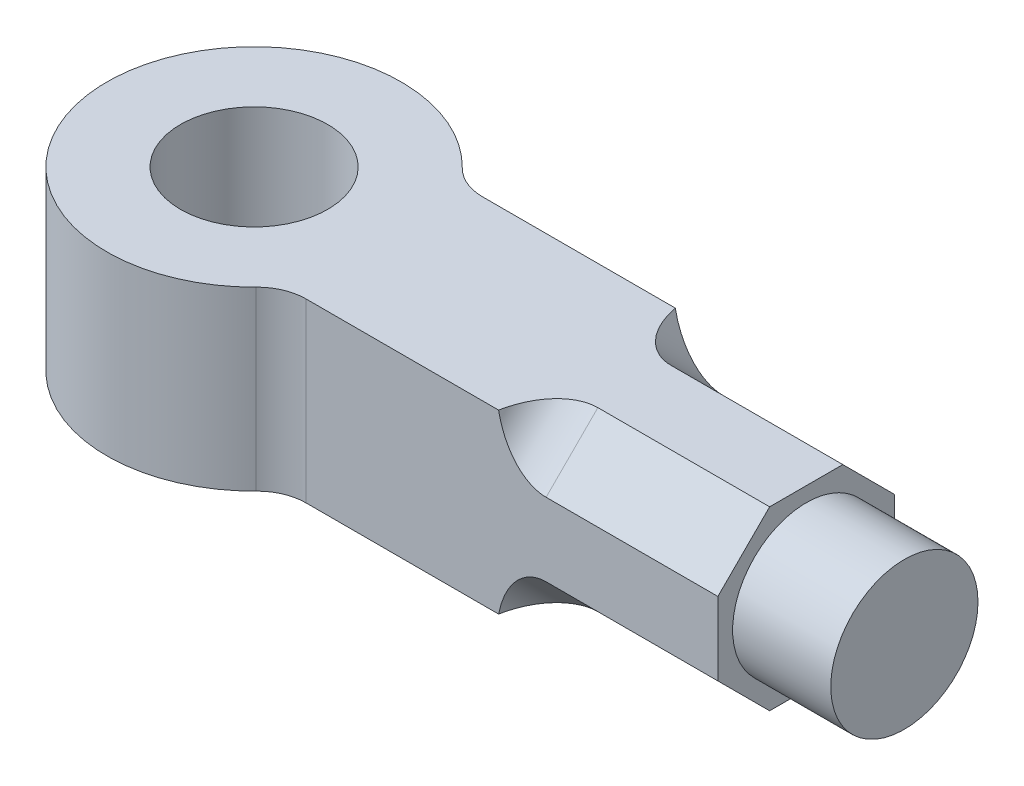
ISO-10303-21;
HEADER;
FILE_DESCRIPTION(('STEP AP214'),'2;1');
FILE_NAME('part.step','',(''),(''),'','','');
FILE_SCHEMA(('AUTOMOTIVE_DESIGN { 1 0 10303 214 1 1 1 1 }'));
ENDSEC;
DATA;
#1=APPLICATION_CONTEXT('core data for automotive mechanical design processes');
#2=APPLICATION_PROTOCOL_DEFINITION('international standard','automotive_design',2000,#1);
#3=PRODUCT_CONTEXT('',#1,'mechanical');
#4=PRODUCT('Part','Part','',(#3));
#5=PRODUCT_RELATED_PRODUCT_CATEGORY('part','',(#4));
#6=PRODUCT_DEFINITION_FORMATION('','',#4);
#7=PRODUCT_DEFINITION_CONTEXT('part definition',#1,'design');
#8=PRODUCT_DEFINITION('design','',#6,#7);
#9=PRODUCT_DEFINITION_SHAPE('','',#8);
#10=(LENGTH_UNIT() NAMED_UNIT(*) SI_UNIT(.MILLI.,.METRE.));
#11=(NAMED_UNIT(*) PLANE_ANGLE_UNIT() SI_UNIT($,.RADIAN.));
#12=(NAMED_UNIT(*) SI_UNIT($,.STERADIAN.) SOLID_ANGLE_UNIT());
#13=UNCERTAINTY_MEASURE_WITH_UNIT(LENGTH_MEASURE(1.E-05),#10,'distance_accuracy_value','');
#14=(GEOMETRIC_REPRESENTATION_CONTEXT(3) GLOBAL_UNCERTAINTY_ASSIGNED_CONTEXT((#13)) GLOBAL_UNIT_ASSIGNED_CONTEXT((#10,
#11,#12)) REPRESENTATION_CONTEXT('',''));
#15=CARTESIAN_POINT('',(0.,0.,0.));
#16=DIRECTION('',(0.,0.,1.));
#17=DIRECTION('',(1.,0.,0.));
#18=AXIS2_PLACEMENT_3D('',#15,#16,#17);
#19=CARTESIAN_POINT('',(0.,18.,0.));
#20=DIRECTION('',(0.,1.,0.));
#21=DIRECTION('',(0.,0.,1.));
#22=AXIS2_PLACEMENT_3D('',#19,#20,#21);
#23=PLANE('',#22);
#24=CARTESIAN_POINT('',(0.,18.,0.));
#25=DIRECTION('',(0.,1.,0.));
#26=DIRECTION('',(0.,0.,1.));
#27=AXIS2_PLACEMENT_3D('',#24,#25,#26);
#28=CIRCLE('',#27,30.);
#29=CARTESIAN_POINT('',(21.4242852856286,18.,-21.));
#30=VERTEX_POINT('',#29);
#31=CARTESIAN_POINT('',(21.4242852856285,18.,21.));
#32=VERTEX_POINT('',#31);
#33=EDGE_CURVE('E180',#30,#32,#28,.T.);
#34=ORIENTED_EDGE('',*,*,#33,.T.);
#35=CARTESIAN_POINT('',(28.5657137141714,18.,28.));
#36=DIRECTION('',(0.,1.,0.));
#37=DIRECTION('',(0.,0.,1.));
#38=AXIS2_PLACEMENT_3D('',#35,#36,#37);
#39=CIRCLE('',#38,10.);
#40=CARTESIAN_POINT('',(28.5657137141714,18.,18.));
#41=VERTEX_POINT('',#40);
#42=EDGE_CURVE('E11',#32,#41,#39,.F.);
#43=ORIENTED_EDGE('',*,*,#42,.T.);
#44=DIRECTION('',(1.,0.,0.));
#45=VECTOR('',#44,1.);
#46=CARTESIAN_POINT('',(24.,18.,18.));
#47=LINE('',#46,#45);
#48=CARTESIAN_POINT('',(67.8290501566764,18.,18.));
#49=VERTEX_POINT('',#48);
#50=EDGE_CURVE('E183',#41,#49,#47,.T.);
#51=ORIENTED_EDGE('',*,*,#50,.T.);
#52=CARTESIAN_POINT('',(77.5,18.,21.5979797464467));
#53=DIRECTION('',(0.,1.,0.));
#54=DIRECTION('',(0.,0.,-1.));
#55=AXIS2_PLACEMENT_3D('',#52,#53,#54);
#56=ELLIPSE('',#55,14.1421356237309,10.);
#57=CARTESIAN_POINT('',(77.5,18.,7.45584412271571));
#58=VERTEX_POINT('',#57);
#59=EDGE_CURVE('E219',#49,#58,#56,.F.);
#60=ORIENTED_EDGE('',*,*,#59,.T.);
#61=DIRECTION('',(-1.,0.,0.));
#62=VECTOR('',#61,1.);
#63=CARTESIAN_POINT('',(112.5,18.,7.45584412271571));
#64=LINE('',#63,#62);
#65=CARTESIAN_POINT('',(112.5,18.,7.45584412271571));
#66=VERTEX_POINT('',#65);
#67=EDGE_CURVE('E245',#66,#58,#64,.T.);
#68=ORIENTED_EDGE('',*,*,#67,.F.);
#69=DIRECTION('',(0.,0.,1.));
#70=VECTOR('',#69,1.);
#71=CARTESIAN_POINT('',(112.5,18.,-7.45584412271571));
#72=LINE('',#71,#70);
#73=CARTESIAN_POINT('',(112.5,18.,-7.45584412271571));
#74=VERTEX_POINT('',#73);
#75=EDGE_CURVE('E155',#74,#66,#72,.T.);
#76=ORIENTED_EDGE('',*,*,#75,.F.);
#77=DIRECTION('',(-1.,0.,0.));
#78=VECTOR('',#77,1.);
#79=CARTESIAN_POINT('',(112.5,18.,-7.45584412271571));
#80=LINE('',#79,#78);
#81=CARTESIAN_POINT('',(77.5,18.,-7.45584412271571));
#82=VERTEX_POINT('',#81);
#83=EDGE_CURVE('E247',#74,#82,#80,.T.);
#84=ORIENTED_EDGE('',*,*,#83,.T.);
#85=CARTESIAN_POINT('',(77.5,18.,-21.5979797464467));
#86=DIRECTION('',(0.,1.,0.));
#87=DIRECTION('',(0.,0.,-1.));
#88=AXIS2_PLACEMENT_3D('',#85,#86,#87);
#89=ELLIPSE('',#88,14.1421356237309,10.);
#90=CARTESIAN_POINT('',(67.8290501566764,18.,-18.));
#91=VERTEX_POINT('',#90);
#92=EDGE_CURVE('E212',#82,#91,#89,.F.);
#93=ORIENTED_EDGE('',*,*,#92,.T.);
#94=DIRECTION('',(-1.,0.,0.));
#95=VECTOR('',#94,1.);
#96=CARTESIAN_POINT('',(24.,18.,-18.));
#97=LINE('',#96,#95);
#98=CARTESIAN_POINT('',(28.5657137141714,18.,-18.));
#99=VERTEX_POINT('',#98);
#100=EDGE_CURVE('E177',#91,#99,#97,.T.);
#101=ORIENTED_EDGE('',*,*,#100,.T.);
#102=CARTESIAN_POINT('',(28.5657137141714,18.,-28.));
#103=DIRECTION('',(0.,1.,0.));
#104=DIRECTION('',(0.,0.,1.));
#105=AXIS2_PLACEMENT_3D('',#102,#103,#104);
#106=CIRCLE('',#105,10.);
#107=EDGE_CURVE('E232',#99,#30,#106,.F.);
#108=ORIENTED_EDGE('',*,*,#107,.T.);
#109=EDGE_LOOP('',(#34,#43,#51,#60,#68,#76,#84,#93,#101,#108));
#110=FACE_BOUND('',#109,.T.);
#111=CARTESIAN_POINT('',(0.,18.,0.));
#112=DIRECTION('',(0.,1.,0.));
#113=DIRECTION('',(0.,0.,1.));
#114=AXIS2_PLACEMENT_3D('',#111,#112,#113);
#115=CIRCLE('',#114,15.);
#116=CARTESIAN_POINT('',(0.,18.,15.));
#117=VERTEX_POINT('',#116);
#118=EDGE_CURVE('E168',#117,#117,#115,.T.);
#119=ORIENTED_EDGE('',*,*,#118,.F.);
#120=EDGE_LOOP('',(#119));
#121=FACE_BOUND('',#120,.T.);
#122=ADVANCED_FACE('F39',(#110,#121),#23,.T.);
#123=CARTESIAN_POINT('',(0.,-18.,0.));
#124=DIRECTION('',(0.,1.,0.));
#125=DIRECTION('',(0.,0.,1.));
#126=AXIS2_PLACEMENT_3D('',#123,#124,#125);
#127=PLANE('',#126);
#128=DIRECTION('',(-1.,0.,0.));
#129=VECTOR('',#128,1.);
#130=CARTESIAN_POINT('',(112.5,-18.,7.4558441227157));
#131=LINE('',#130,#129);
#132=CARTESIAN_POINT('',(112.5,-18.,7.4558441227157));
#133=VERTEX_POINT('',#132);
#134=CARTESIAN_POINT('',(77.5,-18.,7.4558441227157));
#135=VERTEX_POINT('',#134);
#136=EDGE_CURVE('E170',#133,#135,#131,.T.);
#137=ORIENTED_EDGE('',*,*,#136,.T.);
#138=CARTESIAN_POINT('',(77.5,-18.,21.5979797464467));
#139=DIRECTION('',(0.,1.,0.));
#140=DIRECTION('',(0.,0.,1.));
#141=AXIS2_PLACEMENT_3D('',#138,#139,#140);
#142=ELLIPSE('',#141,14.142135623731,10.);
#143=CARTESIAN_POINT('',(67.8290501566764,-18.,18.));
#144=VERTEX_POINT('',#143);
#145=EDGE_CURVE('E202',#135,#144,#142,.T.);
#146=ORIENTED_EDGE('',*,*,#145,.T.);
#147=DIRECTION('',(1.,0.,0.));
#148=VECTOR('',#147,1.);
#149=CARTESIAN_POINT('',(24.,-18.,18.));
#150=LINE('',#149,#148);
#151=CARTESIAN_POINT('',(28.5657137141714,-18.,18.));
#152=VERTEX_POINT('',#151);
#153=EDGE_CURVE('E181',#152,#144,#150,.T.);
#154=ORIENTED_EDGE('',*,*,#153,.F.);
#155=CARTESIAN_POINT('',(28.5657137141714,-18.,28.));
#156=DIRECTION('',(0.,1.,0.));
#157=DIRECTION('',(0.,0.,1.));
#158=AXIS2_PLACEMENT_3D('',#155,#156,#157);
#159=CIRCLE('',#158,10.);
#160=CARTESIAN_POINT('',(21.4242852856285,-18.,21.));
#161=VERTEX_POINT('',#160);
#162=EDGE_CURVE('E47',#152,#161,#159,.T.);
#163=ORIENTED_EDGE('',*,*,#162,.T.);
#164=CARTESIAN_POINT('',(0.,-18.,0.));
#165=DIRECTION('',(0.,1.,0.));
#166=DIRECTION('',(0.,0.,1.));
#167=AXIS2_PLACEMENT_3D('',#164,#165,#166);
#168=CIRCLE('',#167,30.);
#169=CARTESIAN_POINT('',(21.4242852856286,-18.,-21.));
#170=VERTEX_POINT('',#169);
#171=EDGE_CURVE('E188',#170,#161,#168,.T.);
#172=ORIENTED_EDGE('',*,*,#171,.F.);
#173=CARTESIAN_POINT('',(28.5657137141714,-18.,-28.));
#174=DIRECTION('',(0.,1.,0.));
#175=DIRECTION('',(0.,0.,1.));
#176=AXIS2_PLACEMENT_3D('',#173,#174,#175);
#177=CIRCLE('',#176,10.);
#178=CARTESIAN_POINT('',(28.5657137141714,-18.,-18.));
#179=VERTEX_POINT('',#178);
#180=EDGE_CURVE('E230',#170,#179,#177,.T.);
#181=ORIENTED_EDGE('',*,*,#180,.T.);
#182=DIRECTION('',(-1.,0.,0.));
#183=VECTOR('',#182,1.);
#184=CARTESIAN_POINT('',(24.,-18.,-18.));
#185=LINE('',#184,#183);
#186=CARTESIAN_POINT('',(67.8290501566764,-18.,-18.));
#187=VERTEX_POINT('',#186);
#188=EDGE_CURVE('E175',#187,#179,#185,.T.);
#189=ORIENTED_EDGE('',*,*,#188,.F.);
#190=CARTESIAN_POINT('',(77.5,-18.,-21.5979797464467));
#191=DIRECTION('',(0.,1.,0.));
#192=DIRECTION('',(0.,0.,1.));
#193=AXIS2_PLACEMENT_3D('',#190,#191,#192);
#194=ELLIPSE('',#193,14.142135623731,10.);
#195=CARTESIAN_POINT('',(77.5,-18.,-7.45584412271571));
#196=VERTEX_POINT('',#195);
#197=EDGE_CURVE('E210',#187,#196,#194,.T.);
#198=ORIENTED_EDGE('',*,*,#197,.T.);
#199=DIRECTION('',(-1.,0.,0.));
#200=VECTOR('',#199,1.);
#201=CARTESIAN_POINT('',(112.5,-18.,-7.45584412271571));
#202=LINE('',#201,#200);
#203=CARTESIAN_POINT('',(112.5,-18.,-7.45584412271571));
#204=VERTEX_POINT('',#203);
#205=EDGE_CURVE('E300',#204,#196,#202,.T.);
#206=ORIENTED_EDGE('',*,*,#205,.F.);
#207=DIRECTION('',(0.,0.,-1.));
#208=VECTOR('',#207,1.);
#209=CARTESIAN_POINT('',(112.5,-18.,7.4558441227157));
#210=LINE('',#209,#208);
#211=EDGE_CURVE('E312',#133,#204,#210,.T.);
#212=ORIENTED_EDGE('',*,*,#211,.F.);
#213=EDGE_LOOP('',(#137,#146,#154,#163,#172,#181,#189,#198,#206,#212));
#214=FACE_BOUND('',#213,.T.);
#215=CARTESIAN_POINT('',(0.,-18.,0.));
#216=DIRECTION('',(0.,1.,0.));
#217=DIRECTION('',(0.,0.,1.));
#218=AXIS2_PLACEMENT_3D('',#215,#216,#217);
#219=CIRCLE('',#218,15.);
#220=CARTESIAN_POINT('',(0.,-18.,15.));
#221=VERTEX_POINT('',#220);
#222=EDGE_CURVE('E165',#221,#221,#219,.T.);
#223=ORIENTED_EDGE('',*,*,#222,.T.);
#224=EDGE_LOOP('',(#223));
#225=FACE_BOUND('',#224,.T.);
#226=ADVANCED_FACE('F237',(#214,#225),#127,.F.);
#227=CARTESIAN_POINT('',(24.,18.,-18.));
#228=DIRECTION('',(0.,0.,1.));
#229=DIRECTION('',(1.,0.,0.));
#230=AXIS2_PLACEMENT_3D('',#227,#228,#229);
#231=PLANE('',#230);
#232=ORIENTED_EDGE('',*,*,#188,.T.);
#233=DIRECTION('',(0.,1.,0.));
#234=VECTOR('',#233,1.);
#235=CARTESIAN_POINT('',(28.5657137141714,18.,-18.));
#236=LINE('',#235,#234);
#237=EDGE_CURVE('E226',#179,#99,#236,.T.);
#238=ORIENTED_EDGE('',*,*,#237,.T.);
#239=ORIENTED_EDGE('',*,*,#100,.F.);
#240=CARTESIAN_POINT('',(77.5,21.5979797464467,-18.));
#241=DIRECTION('',(0.,0.,1.));
#242=DIRECTION('',(0.,-1.,0.));
#243=AXIS2_PLACEMENT_3D('',#240,#241,#242);
#244=ELLIPSE('',#243,14.142135623731,10.);
#245=CARTESIAN_POINT('',(77.5,7.45584412271571,-18.));
#246=VERTEX_POINT('',#245);
#247=EDGE_CURVE('E215',#91,#246,#244,.T.);
#248=ORIENTED_EDGE('',*,*,#247,.T.);
#249=DIRECTION('',(-1.,0.,0.));
#250=VECTOR('',#249,1.);
#251=CARTESIAN_POINT('',(112.5,7.45584412271571,-18.));
#252=LINE('',#251,#250);
#253=CARTESIAN_POINT('',(112.5,7.45584412271571,-18.));
#254=VERTEX_POINT('',#253);
#255=EDGE_CURVE('E303',#254,#246,#252,.T.);
#256=ORIENTED_EDGE('',*,*,#255,.F.);
#257=DIRECTION('',(0.,1.,0.));
#258=VECTOR('',#257,1.);
#259=CARTESIAN_POINT('',(112.5,-7.45584412271571,-18.));
#260=LINE('',#259,#258);
#261=CARTESIAN_POINT('',(112.5,-7.45584412271571,-18.));
#262=VERTEX_POINT('',#261);
#263=EDGE_CURVE('E302',#262,#254,#260,.T.);
#264=ORIENTED_EDGE('',*,*,#263,.F.);
#265=DIRECTION('',(-1.,0.,0.));
#266=VECTOR('',#265,1.);
#267=CARTESIAN_POINT('',(112.5,-7.45584412271571,-18.));
#268=LINE('',#267,#266);
#269=CARTESIAN_POINT('',(77.5,-7.45584412271571,-18.));
#270=VERTEX_POINT('',#269);
#271=EDGE_CURVE('E297',#262,#270,#268,.T.);
#272=ORIENTED_EDGE('',*,*,#271,.T.);
#273=CARTESIAN_POINT('',(77.5,-21.5979797464467,-18.));
#274=DIRECTION('',(0.,0.,1.));
#275=DIRECTION('',(0.,-1.,0.));
#276=AXIS2_PLACEMENT_3D('',#273,#274,#275);
#277=ELLIPSE('',#276,14.1421356237309,10.);
#278=EDGE_CURVE('E207',#270,#187,#277,.T.);
#279=ORIENTED_EDGE('',*,*,#278,.T.);
#280=EDGE_LOOP('',(#232,#238,#239,#248,#256,#264,#272,#279));
#281=FACE_BOUND('',#280,.T.);
#282=ADVANCED_FACE('F267',(#281),#231,.F.);
#283=CARTESIAN_POINT('',(0.,18.,0.));
#284=DIRECTION('',(0.,-1.,0.));
#285=DIRECTION('',(0.,0.,-1.));
#286=AXIS2_PLACEMENT_3D('',#283,#284,#285);
#287=CYLINDRICAL_SURFACE('',#286,30.);
#288=ORIENTED_EDGE('',*,*,#33,.F.);
#289=DIRECTION('',(0.,-1.,0.));
#290=VECTOR('',#289,1.);
#291=CARTESIAN_POINT('',(21.4242852856286,18.,-21.));
#292=LINE('',#291,#290);
#293=EDGE_CURVE('E223',#30,#170,#292,.T.);
#294=ORIENTED_EDGE('',*,*,#293,.T.);
#295=ORIENTED_EDGE('',*,*,#171,.T.);
#296=DIRECTION('',(0.,-1.,0.));
#297=VECTOR('',#296,1.);
#298=CARTESIAN_POINT('',(21.4242852856285,18.,21.));
#299=LINE('',#298,#297);
#300=EDGE_CURVE('E221',#161,#32,#299,.F.);
#301=ORIENTED_EDGE('',*,*,#300,.T.);
#302=EDGE_LOOP('',(#288,#294,#295,#301));
#303=FACE_BOUND('',#302,.T.);
#304=ADVANCED_FACE('F241',(#303),#287,.T.);
#305=CARTESIAN_POINT('',(24.,18.,18.));
#306=DIRECTION('',(0.,0.,-1.));
#307=DIRECTION('',(-1.,0.,0.));
#308=AXIS2_PLACEMENT_3D('',#305,#306,#307);
#309=PLANE('',#308);
#310=ORIENTED_EDGE('',*,*,#50,.F.);
#311=DIRECTION('',(0.,1.,0.));
#312=VECTOR('',#311,1.);
#313=CARTESIAN_POINT('',(28.5657137141714,-18.,18.));
#314=LINE('',#313,#312);
#315=EDGE_CURVE('E228',#41,#152,#314,.F.);
#316=ORIENTED_EDGE('',*,*,#315,.T.);
#317=ORIENTED_EDGE('',*,*,#153,.T.);
#318=CARTESIAN_POINT('',(77.5,-21.5979797464467,18.));
#319=DIRECTION('',(0.,0.,-1.));
#320=DIRECTION('',(0.,1.,0.));
#321=AXIS2_PLACEMENT_3D('',#318,#319,#320);
#322=ELLIPSE('',#321,14.1421356237309,10.);
#323=CARTESIAN_POINT('',(77.5,-7.45584412271571,18.));
#324=VERTEX_POINT('',#323);
#325=EDGE_CURVE('E205',#144,#324,#322,.T.);
#326=ORIENTED_EDGE('',*,*,#325,.T.);
#327=DIRECTION('',(-1.,0.,0.));
#328=VECTOR('',#327,1.);
#329=CARTESIAN_POINT('',(112.5,-7.45584412271571,18.));
#330=LINE('',#329,#328);
#331=CARTESIAN_POINT('',(112.5,-7.45584412271571,18.));
#332=VERTEX_POINT('',#331);
#333=EDGE_CURVE('E146',#332,#324,#330,.T.);
#334=ORIENTED_EDGE('',*,*,#333,.F.);
#335=DIRECTION('',(0.,-1.,0.));
#336=VECTOR('',#335,1.);
#337=CARTESIAN_POINT('',(112.5,7.45584412271571,18.));
#338=LINE('',#337,#336);
#339=CARTESIAN_POINT('',(112.5,7.45584412271571,18.));
#340=VERTEX_POINT('',#339);
#341=EDGE_CURVE('E139',#340,#332,#338,.T.);
#342=ORIENTED_EDGE('',*,*,#341,.F.);
#343=DIRECTION('',(-1.,0.,0.));
#344=VECTOR('',#343,1.);
#345=CARTESIAN_POINT('',(112.5,7.45584412271571,18.));
#346=LINE('',#345,#344);
#347=CARTESIAN_POINT('',(77.5,7.45584412271571,18.));
#348=VERTEX_POINT('',#347);
#349=EDGE_CURVE('E144',#340,#348,#346,.T.);
#350=ORIENTED_EDGE('',*,*,#349,.T.);
#351=CARTESIAN_POINT('',(77.5,21.5979797464467,18.));
#352=DIRECTION('',(0.,0.,-1.));
#353=DIRECTION('',(0.,1.,0.));
#354=AXIS2_PLACEMENT_3D('',#351,#352,#353);
#355=ELLIPSE('',#354,14.1421356237309,10.);
#356=EDGE_CURVE('E217',#348,#49,#355,.T.);
#357=ORIENTED_EDGE('',*,*,#356,.T.);
#358=EDGE_LOOP('',(#310,#316,#317,#326,#334,#342,#350,#357));
#359=FACE_BOUND('',#358,.T.);
#360=ADVANCED_FACE('F141',(#359),#309,.F.);
#361=CARTESIAN_POINT('',(0.,18.,0.));
#362=DIRECTION('',(0.,-1.,0.));
#363=DIRECTION('',(0.,0.,-1.));
#364=AXIS2_PLACEMENT_3D('',#361,#362,#363);
#365=CYLINDRICAL_SURFACE('',#364,15.);
#366=ORIENTED_EDGE('',*,*,#118,.T.);
#367=EDGE_LOOP('',(#366));
#368=FACE_BOUND('',#367,.T.);
#369=ORIENTED_EDGE('',*,*,#222,.F.);
#370=EDGE_LOOP('',(#369));
#371=FACE_BOUND('',#370,.T.);
#372=ADVANCED_FACE('F270',(#368,#371),#365,.F.);
#373=CARTESIAN_POINT('',(112.5,18.,7.45584412271571));
#374=DIRECTION('',(0.,-0.707106781186547,-0.707106781186547));
#375=DIRECTION('',(0.,0.707106781186548,-0.707106781186548));
#376=AXIS2_PLACEMENT_3D('',#373,#374,#375);
#377=PLANE('',#376);
#378=ORIENTED_EDGE('',*,*,#67,.T.);
#379=DIRECTION('',(0.,-0.707106781186548,0.707106781186548));
#380=VECTOR('',#379,1.);
#381=CARTESIAN_POINT('',(77.5,7.45584412271571,18.));
#382=LINE('',#381,#380);
#383=EDGE_CURVE('E164',#58,#348,#382,.T.);
#384=ORIENTED_EDGE('',*,*,#383,.T.);
#385=ORIENTED_EDGE('',*,*,#349,.F.);
#386=DIRECTION('',(0.,-0.707106781186548,0.707106781186548));
#387=VECTOR('',#386,1.);
#388=CARTESIAN_POINT('',(112.5,18.,7.45584412271571));
#389=LINE('',#388,#387);
#390=EDGE_CURVE('E150',#66,#340,#389,.T.);
#391=ORIENTED_EDGE('',*,*,#390,.F.);
#392=EDGE_LOOP('',(#378,#384,#385,#391));
#393=FACE_BOUND('',#392,.T.);
#394=ADVANCED_FACE('F162',(#393),#377,.F.);
#395=CARTESIAN_POINT('',(112.5,-7.45584412271571,18.));
#396=DIRECTION('',(0.,0.707106781186548,-0.707106781186547));
#397=DIRECTION('',(0.,0.707106781186547,0.707106781186548));
#398=AXIS2_PLACEMENT_3D('',#395,#396,#397);
#399=PLANE('',#398);
#400=ORIENTED_EDGE('',*,*,#333,.T.);
#401=DIRECTION('',(0.,-0.707106781186547,-0.707106781186548));
#402=VECTOR('',#401,1.);
#403=CARTESIAN_POINT('',(77.5,-18.,7.4558441227157));
#404=LINE('',#403,#402);
#405=EDGE_CURVE('E192',#324,#135,#404,.T.);
#406=ORIENTED_EDGE('',*,*,#405,.T.);
#407=ORIENTED_EDGE('',*,*,#136,.F.);
#408=DIRECTION('',(0.,-0.707106781186547,-0.707106781186548));
#409=VECTOR('',#408,1.);
#410=CARTESIAN_POINT('',(112.5,-7.45584412271571,18.));
#411=LINE('',#410,#409);
#412=EDGE_CURVE('E149',#332,#133,#411,.T.);
#413=ORIENTED_EDGE('',*,*,#412,.F.);
#414=EDGE_LOOP('',(#400,#406,#407,#413));
#415=FACE_BOUND('',#414,.T.);
#416=ADVANCED_FACE('F314',(#415),#399,.F.);
#417=CARTESIAN_POINT('',(112.5,-18.,-7.45584412271571));
#418=DIRECTION('',(0.,0.707106781186548,0.707106781186547));
#419=DIRECTION('',(0.,-0.707106781186547,0.707106781186548));
#420=AXIS2_PLACEMENT_3D('',#417,#418,#419);
#421=PLANE('',#420);
#422=ORIENTED_EDGE('',*,*,#205,.T.);
#423=DIRECTION('',(0.,0.707106781186547,-0.707106781186548));
#424=VECTOR('',#423,1.);
#425=CARTESIAN_POINT('',(77.5,-7.45584412271572,-18.));
#426=LINE('',#425,#424);
#427=EDGE_CURVE('E195',#196,#270,#426,.T.);
#428=ORIENTED_EDGE('',*,*,#427,.T.);
#429=ORIENTED_EDGE('',*,*,#271,.F.);
#430=DIRECTION('',(0.,0.707106781186547,-0.707106781186548));
#431=VECTOR('',#430,1.);
#432=CARTESIAN_POINT('',(112.5,-18.,-7.45584412271571));
#433=LINE('',#432,#431);
#434=EDGE_CURVE('E317',#204,#262,#433,.T.);
#435=ORIENTED_EDGE('',*,*,#434,.F.);
#436=EDGE_LOOP('',(#422,#428,#429,#435));
#437=FACE_BOUND('',#436,.T.);
#438=ADVANCED_FACE('F295',(#437),#421,.F.);
#439=CARTESIAN_POINT('',(112.5,7.45584412271571,-18.));
#440=DIRECTION('',(0.,-0.707106781186547,0.707106781186548));
#441=DIRECTION('',(0.,-0.707106781186548,-0.707106781186547));
#442=AXIS2_PLACEMENT_3D('',#439,#440,#441);
#443=PLANE('',#442);
#444=ORIENTED_EDGE('',*,*,#255,.T.);
#445=DIRECTION('',(0.,0.707106781186548,0.707106781186547));
#446=VECTOR('',#445,1.);
#447=CARTESIAN_POINT('',(77.5,18.,-7.45584412271572));
#448=LINE('',#447,#446);
#449=EDGE_CURVE('E198',#246,#82,#448,.T.);
#450=ORIENTED_EDGE('',*,*,#449,.T.);
#451=ORIENTED_EDGE('',*,*,#83,.F.);
#452=DIRECTION('',(0.,0.707106781186548,0.707106781186547));
#453=VECTOR('',#452,1.);
#454=CARTESIAN_POINT('',(112.5,7.45584412271571,-18.));
#455=LINE('',#454,#453);
#456=EDGE_CURVE('E322',#254,#74,#455,.T.);
#457=ORIENTED_EDGE('',*,*,#456,.F.);
#458=EDGE_LOOP('',(#444,#450,#451,#457));
#459=FACE_BOUND('',#458,.T.);
#460=ADVANCED_FACE('F329',(#459),#443,.F.);
#461=CARTESIAN_POINT('',(112.5,0.,0.));
#462=DIRECTION('',(1.,0.,0.));
#463=DIRECTION('',(0.,0.,-1.));
#464=AXIS2_PLACEMENT_3D('',#461,#462,#463);
#465=PLANE('',#464);
#466=CARTESIAN_POINT('',(112.5,0.,0.));
#467=DIRECTION('',(1.,0.,0.));
#468=DIRECTION('',(0.,0.,-1.));
#469=AXIS2_PLACEMENT_3D('',#466,#467,#468);
#470=CIRCLE('',#469,15.);
#471=CARTESIAN_POINT('',(112.5,0.,-15.));
#472=VERTEX_POINT('',#471);
#473=EDGE_CURVE('E185',#472,#472,#470,.T.);
#474=ORIENTED_EDGE('',*,*,#473,.F.);
#475=EDGE_LOOP('',(#474));
#476=FACE_BOUND('',#475,.T.);
#477=ORIENTED_EDGE('',*,*,#390,.T.);
#478=ORIENTED_EDGE('',*,*,#341,.T.);
#479=ORIENTED_EDGE('',*,*,#412,.T.);
#480=ORIENTED_EDGE('',*,*,#211,.T.);
#481=ORIENTED_EDGE('',*,*,#434,.T.);
#482=ORIENTED_EDGE('',*,*,#263,.T.);
#483=ORIENTED_EDGE('',*,*,#456,.T.);
#484=ORIENTED_EDGE('',*,*,#75,.T.);
#485=EDGE_LOOP('',(#477,#478,#479,#480,#481,#482,#483,#484));
#486=FACE_BOUND('',#485,.T.);
#487=ADVANCED_FACE('F153',(#476,#486),#465,.T.);
#488=CARTESIAN_POINT('',(132.5,0.,0.));
#489=DIRECTION('',(-1.,0.,0.));
#490=DIRECTION('',(0.,0.,1.));
#491=AXIS2_PLACEMENT_3D('',#488,#489,#490);
#492=CYLINDRICAL_SURFACE('',#491,15.);
#493=CARTESIAN_POINT('',(132.5,0.,0.));
#494=DIRECTION('',(1.,0.,0.));
#495=DIRECTION('',(0.,0.,-1.));
#496=AXIS2_PLACEMENT_3D('',#493,#494,#495);
#497=CIRCLE('',#496,15.);
#498=CARTESIAN_POINT('',(132.5,0.,-15.));
#499=VERTEX_POINT('',#498);
#500=EDGE_CURVE('E159',#499,#499,#497,.T.);
#501=ORIENTED_EDGE('',*,*,#500,.F.);
#502=EDGE_LOOP('',(#501));
#503=FACE_BOUND('',#502,.T.);
#504=ORIENTED_EDGE('',*,*,#473,.T.);
#505=EDGE_LOOP('',(#504));
#506=FACE_BOUND('',#505,.T.);
#507=ADVANCED_FACE('F339',(#503,#506),#492,.T.);
#508=CARTESIAN_POINT('',(132.5,0.,0.));
#509=DIRECTION('',(1.,0.,0.));
#510=DIRECTION('',(0.,0.,-1.));
#511=AXIS2_PLACEMENT_3D('',#508,#509,#510);
#512=PLANE('',#511);
#513=ORIENTED_EDGE('',*,*,#500,.T.);
#514=EDGE_LOOP('',(#513));
#515=FACE_BOUND('',#514,.T.);
#516=ADVANCED_FACE('F283',(#515),#512,.T.);
#517=CARTESIAN_POINT('',(77.5,-14.5269119345812,25.0710678118655));
#518=DIRECTION('',(0.,0.707106781186547,0.707106781186548));
#519=DIRECTION('',(0.,-0.707106781186548,0.707106781186547));
#520=AXIS2_PLACEMENT_3D('',#517,#518,#519);
#521=CYLINDRICAL_SURFACE('',#520,10.);
#522=ORIENTED_EDGE('',*,*,#405,.F.);
#523=ORIENTED_EDGE('',*,*,#325,.F.);
#524=ORIENTED_EDGE('',*,*,#145,.F.);
#525=EDGE_LOOP('',(#522,#523,#524));
#526=FACE_BOUND('',#525,.T.);
#527=ADVANCED_FACE('F280',(#526),#521,.F.);
#528=CARTESIAN_POINT('',(77.5,-25.0710678118655,-14.5269119345812));
#529=DIRECTION('',(0.,-0.707106781186547,0.707106781186548));
#530=DIRECTION('',(0.,-0.707106781186548,-0.707106781186547));
#531=AXIS2_PLACEMENT_3D('',#528,#529,#530);
#532=CYLINDRICAL_SURFACE('',#531,10.);
#533=ORIENTED_EDGE('',*,*,#427,.F.);
#534=ORIENTED_EDGE('',*,*,#197,.F.);
#535=ORIENTED_EDGE('',*,*,#278,.F.);
#536=EDGE_LOOP('',(#533,#534,#535));
#537=FACE_BOUND('',#536,.T.);
#538=ADVANCED_FACE('F260',(#537),#532,.F.);
#539=CARTESIAN_POINT('',(77.5,14.5269119345812,-25.0710678118655));
#540=DIRECTION('',(0.,-0.707106781186548,-0.707106781186547));
#541=DIRECTION('',(0.,0.707106781186547,-0.707106781186548));
#542=AXIS2_PLACEMENT_3D('',#539,#540,#541);
#543=CYLINDRICAL_SURFACE('',#542,10.);
#544=ORIENTED_EDGE('',*,*,#449,.F.);
#545=ORIENTED_EDGE('',*,*,#247,.F.);
#546=ORIENTED_EDGE('',*,*,#92,.F.);
#547=EDGE_LOOP('',(#544,#545,#546));
#548=FACE_BOUND('',#547,.T.);
#549=ADVANCED_FACE('F252',(#548),#543,.F.);
#550=CARTESIAN_POINT('',(77.5,25.0710678118655,14.5269119345812));
#551=DIRECTION('',(0.,0.707106781186548,-0.707106781186548));
#552=DIRECTION('',(0.,0.707106781186548,0.707106781186548));
#553=AXIS2_PLACEMENT_3D('',#550,#551,#552);
#554=CYLINDRICAL_SURFACE('',#553,10.);
#555=ORIENTED_EDGE('',*,*,#383,.F.);
#556=ORIENTED_EDGE('',*,*,#59,.F.);
#557=ORIENTED_EDGE('',*,*,#356,.F.);
#558=EDGE_LOOP('',(#555,#556,#557));
#559=FACE_BOUND('',#558,.T.);
#560=ADVANCED_FACE('F249',(#559),#554,.F.);
#561=CARTESIAN_POINT('',(28.5657137141714,18.,-28.));
#562=DIRECTION('',(0.,-1.,0.));
#563=DIRECTION('',(0.,0.,-1.));
#564=AXIS2_PLACEMENT_3D('',#561,#562,#563);
#565=CYLINDRICAL_SURFACE('',#564,10.);
#566=ORIENTED_EDGE('',*,*,#107,.F.);
#567=ORIENTED_EDGE('',*,*,#237,.F.);
#568=ORIENTED_EDGE('',*,*,#180,.F.);
#569=ORIENTED_EDGE('',*,*,#293,.F.);
#570=EDGE_LOOP('',(#566,#567,#568,#569));
#571=FACE_BOUND('',#570,.T.);
#572=ADVANCED_FACE('F251',(#571),#565,.F.);
#573=CARTESIAN_POINT('',(28.5657137141714,18.,28.));
#574=DIRECTION('',(0.,-1.,0.));
#575=DIRECTION('',(0.,0.,-1.));
#576=AXIS2_PLACEMENT_3D('',#573,#574,#575);
#577=CYLINDRICAL_SURFACE('',#576,10.);
#578=ORIENTED_EDGE('',*,*,#42,.F.);
#579=ORIENTED_EDGE('',*,*,#300,.F.);
#580=ORIENTED_EDGE('',*,*,#162,.F.);
#581=ORIENTED_EDGE('',*,*,#315,.F.);
#582=EDGE_LOOP('',(#578,#579,#580,#581));
#583=FACE_BOUND('',#582,.T.);
#584=ADVANCED_FACE('F41',(#583),#577,.F.);
#585=CLOSED_SHELL('',(#122,#226,#282,#304,#360,#372,#394,#416,#438,#460,#487,#507,#516,#527,
#538,#549,#560,#572,#584));
#586=MANIFOLD_SOLID_BREP('B2',#585);
#587=ADVANCED_BREP_SHAPE_REPRESENTATION('',(#18,#586),#14);
#588=SHAPE_DEFINITION_REPRESENTATION(#9,#587);
ENDSEC;
END-ISO-10303-21;
